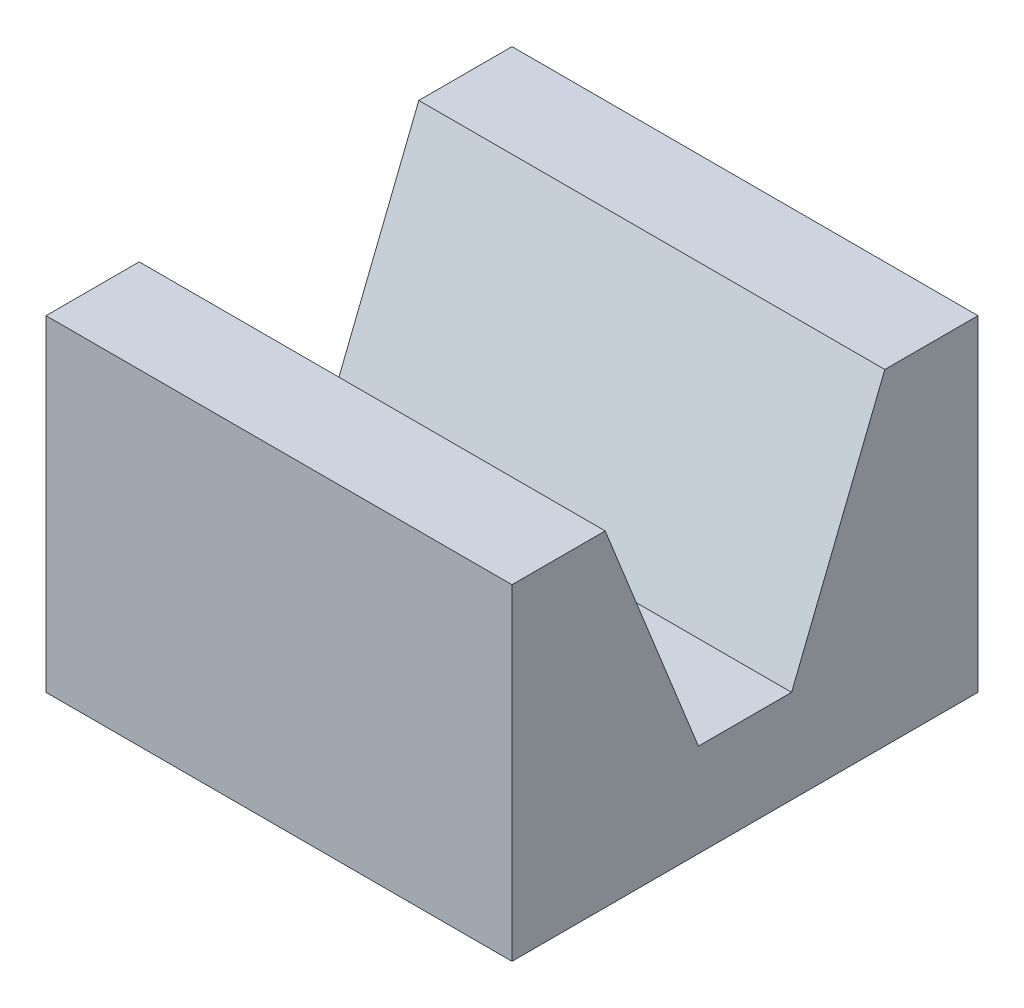
ISO-10303-21;
HEADER;
FILE_DESCRIPTION(('STEP AP214'),'2;1');
FILE_NAME('part.step','',(''),(''),'','','');
FILE_SCHEMA(('AUTOMOTIVE_DESIGN { 1 0 10303 214 1 1 1 1 }'));
ENDSEC;
DATA;
#1=APPLICATION_CONTEXT('core data for automotive mechanical design processes');
#2=APPLICATION_PROTOCOL_DEFINITION('international standard','automotive_design',2000,#1);
#3=PRODUCT_CONTEXT('',#1,'mechanical');
#4=PRODUCT('Part','Part','',(#3));
#5=PRODUCT_RELATED_PRODUCT_CATEGORY('part','',(#4));
#6=PRODUCT_DEFINITION_FORMATION('','',#4);
#7=PRODUCT_DEFINITION_CONTEXT('part definition',#1,'design');
#8=PRODUCT_DEFINITION('design','',#6,#7);
#9=PRODUCT_DEFINITION_SHAPE('','',#8);
#10=(LENGTH_UNIT() NAMED_UNIT(*) SI_UNIT(.MILLI.,.METRE.));
#11=(NAMED_UNIT(*) PLANE_ANGLE_UNIT() SI_UNIT($,.RADIAN.));
#12=(NAMED_UNIT(*) SI_UNIT($,.STERADIAN.) SOLID_ANGLE_UNIT());
#13=UNCERTAINTY_MEASURE_WITH_UNIT(LENGTH_MEASURE(1.E-05),#10,'distance_accuracy_value','');
#14=(GEOMETRIC_REPRESENTATION_CONTEXT(3) GLOBAL_UNCERTAINTY_ASSIGNED_CONTEXT((#13)) GLOBAL_UNIT_ASSIGNED_CONTEXT((#10,
#11,#12)) REPRESENTATION_CONTEXT('',''));
#15=CARTESIAN_POINT('',(0.,0.,0.));
#16=DIRECTION('',(0.,0.,1.));
#17=DIRECTION('',(1.,0.,0.));
#18=AXIS2_PLACEMENT_3D('',#15,#16,#17);
#19=CARTESIAN_POINT('',(100.,0.,0.));
#20=DIRECTION('',(0.,1.,0.));
#21=DIRECTION('',(0.,0.,1.));
#22=AXIS2_PLACEMENT_3D('',#19,#20,#21);
#23=PLANE('',#22);
#24=DIRECTION('',(0.,0.,-1.));
#25=VECTOR('',#24,1.);
#26=CARTESIAN_POINT('',(0.,0.,0.));
#27=LINE('',#26,#25);
#28=CARTESIAN_POINT('',(0.,0.,50.));
#29=VERTEX_POINT('',#28);
#30=CARTESIAN_POINT('',(0.,0.,-50.));
#31=VERTEX_POINT('',#30);
#32=EDGE_CURVE('E77',#29,#31,#27,.T.);
#33=ORIENTED_EDGE('',*,*,#32,.T.);
#34=DIRECTION('',(-1.,0.,0.));
#35=VECTOR('',#34,1.);
#36=CARTESIAN_POINT('',(100.,0.,-50.));
#37=LINE('',#36,#35);
#38=CARTESIAN_POINT('',(100.,0.,-50.));
#39=VERTEX_POINT('',#38);
#40=EDGE_CURVE('E11',#39,#31,#37,.T.);
#41=ORIENTED_EDGE('',*,*,#40,.F.);
#42=DIRECTION('',(0.,0.,-1.));
#43=VECTOR('',#42,1.);
#44=CARTESIAN_POINT('',(100.,0.,0.));
#45=LINE('',#44,#43);
#46=CARTESIAN_POINT('',(100.,0.,50.));
#47=VERTEX_POINT('',#46);
#48=EDGE_CURVE('E86',#47,#39,#45,.T.);
#49=ORIENTED_EDGE('',*,*,#48,.F.);
#50=DIRECTION('',(-1.,0.,0.));
#51=VECTOR('',#50,1.);
#52=CARTESIAN_POINT('',(100.,0.,50.));
#53=LINE('',#52,#51);
#54=EDGE_CURVE('E104',#47,#29,#53,.T.);
#55=ORIENTED_EDGE('',*,*,#54,.T.);
#56=EDGE_LOOP('',(#33,#41,#49,#55));
#57=FACE_BOUND('',#56,.T.);
#58=ADVANCED_FACE('F33',(#57),#23,.F.);
#59=CARTESIAN_POINT('',(100.,0.,-50.));
#60=DIRECTION('',(0.,0.,1.));
#61=DIRECTION('',(1.,0.,0.));
#62=AXIS2_PLACEMENT_3D('',#59,#60,#61);
#63=PLANE('',#62);
#64=DIRECTION('',(0.,1.,0.));
#65=VECTOR('',#64,1.);
#66=CARTESIAN_POINT('',(0.,0.,-50.));
#67=LINE('',#66,#65);
#68=CARTESIAN_POINT('',(0.,70.,-50.));
#69=VERTEX_POINT('',#68);
#70=EDGE_CURVE('E68',#31,#69,#67,.T.);
#71=ORIENTED_EDGE('',*,*,#70,.T.);
#72=DIRECTION('',(-1.,0.,0.));
#73=VECTOR('',#72,1.);
#74=CARTESIAN_POINT('',(100.,70.,-50.));
#75=LINE('',#74,#73);
#76=CARTESIAN_POINT('',(100.,70.,-50.));
#77=VERTEX_POINT('',#76);
#78=EDGE_CURVE('E40',#77,#69,#75,.T.);
#79=ORIENTED_EDGE('',*,*,#78,.F.);
#80=DIRECTION('',(0.,1.,0.));
#81=VECTOR('',#80,1.);
#82=CARTESIAN_POINT('',(100.,0.,-50.));
#83=LINE('',#82,#81);
#84=EDGE_CURVE('E56',#39,#77,#83,.T.);
#85=ORIENTED_EDGE('',*,*,#84,.F.);
#86=ORIENTED_EDGE('',*,*,#40,.T.);
#87=EDGE_LOOP('',(#71,#79,#85,#86));
#88=FACE_BOUND('',#87,.T.);
#89=ADVANCED_FACE('F70',(#88),#63,.F.);
#90=CARTESIAN_POINT('',(100.,70.,0.));
#91=DIRECTION('',(0.,-1.,0.));
#92=DIRECTION('',(0.,0.,-1.));
#93=AXIS2_PLACEMENT_3D('',#90,#91,#92);
#94=PLANE('',#93);
#95=DIRECTION('',(0.,0.,1.));
#96=VECTOR('',#95,1.);
#97=CARTESIAN_POINT('',(0.,70.,0.));
#98=LINE('',#97,#96);
#99=CARTESIAN_POINT('',(0.,70.,-30.));
#100=VERTEX_POINT('',#99);
#101=EDGE_CURVE('E76',#69,#100,#98,.T.);
#102=ORIENTED_EDGE('',*,*,#101,.T.);
#103=DIRECTION('',(1.,0.,0.));
#104=VECTOR('',#103,1.);
#105=CARTESIAN_POINT('',(0.,70.,-30.));
#106=LINE('',#105,#104);
#107=CARTESIAN_POINT('',(100.,70.,-30.));
#108=VERTEX_POINT('',#107);
#109=EDGE_CURVE('E91',#100,#108,#106,.T.);
#110=ORIENTED_EDGE('',*,*,#109,.T.);
#111=DIRECTION('',(0.,0.,1.));
#112=VECTOR('',#111,1.);
#113=CARTESIAN_POINT('',(100.,70.,0.));
#114=LINE('',#113,#112);
#115=EDGE_CURVE('E83',#77,#108,#114,.T.);
#116=ORIENTED_EDGE('',*,*,#115,.F.);
#117=ORIENTED_EDGE('',*,*,#78,.T.);
#118=EDGE_LOOP('',(#102,#110,#116,#117));
#119=FACE_BOUND('',#118,.T.);
#120=ADVANCED_FACE('F81',(#119),#94,.F.);
#121=CARTESIAN_POINT('',(100.,0.,0.));
#122=DIRECTION('',(-1.,0.,0.));
#123=DIRECTION('',(0.,0.,1.));
#124=AXIS2_PLACEMENT_3D('',#121,#122,#123);
#125=PLANE('',#124);
#126=ORIENTED_EDGE('',*,*,#115,.T.);
#127=DIRECTION('',(0.,0.928476690885259,-0.371390676354104));
#128=VECTOR('',#127,1.);
#129=CARTESIAN_POINT('',(100.,70.,-30.));
#130=LINE('',#129,#128);
#131=CARTESIAN_POINT('',(100.,20.,-10.));
#132=VERTEX_POINT('',#131);
#133=EDGE_CURVE('E97',#132,#108,#130,.T.);
#134=ORIENTED_EDGE('',*,*,#133,.F.);
#135=DIRECTION('',(0.,0.,-1.));
#136=VECTOR('',#135,1.);
#137=CARTESIAN_POINT('',(100.,20.,-10.));
#138=LINE('',#137,#136);
#139=CARTESIAN_POINT('',(100.,20.,10.));
#140=VERTEX_POINT('',#139);
#141=EDGE_CURVE('E101',#140,#132,#138,.T.);
#142=ORIENTED_EDGE('',*,*,#141,.F.);
#143=DIRECTION('',(0.,0.928476690885259,0.371390676354104));
#144=VECTOR('',#143,1.);
#145=CARTESIAN_POINT('',(100.,70.,30.));
#146=LINE('',#145,#144);
#147=CARTESIAN_POINT('',(100.,70.,30.));
#148=VERTEX_POINT('',#147);
#149=EDGE_CURVE('E131',#140,#148,#146,.T.);
#150=ORIENTED_EDGE('',*,*,#149,.T.);
#151=DIRECTION('',(0.,0.,-1.));
#152=VECTOR('',#151,1.);
#153=CARTESIAN_POINT('',(100.,70.,0.));
#154=LINE('',#153,#152);
#155=CARTESIAN_POINT('',(100.,70.,50.));
#156=VERTEX_POINT('',#155);
#157=EDGE_CURVE('E112',#156,#148,#154,.T.);
#158=ORIENTED_EDGE('',*,*,#157,.F.);
#159=DIRECTION('',(0.,1.,0.));
#160=VECTOR('',#159,1.);
#161=CARTESIAN_POINT('',(100.,0.,50.));
#162=LINE('',#161,#160);
#163=EDGE_CURVE('E116',#47,#156,#162,.T.);
#164=ORIENTED_EDGE('',*,*,#163,.F.);
#165=ORIENTED_EDGE('',*,*,#48,.T.);
#166=ORIENTED_EDGE('',*,*,#84,.T.);
#167=EDGE_LOOP('',(#126,#134,#142,#150,#158,#164,#165,#166));
#168=FACE_BOUND('',#167,.T.);
#169=ADVANCED_FACE('F164',(#168),#125,.F.);
#170=CARTESIAN_POINT('',(0.,0.,0.));
#171=DIRECTION('',(-1.,0.,0.));
#172=DIRECTION('',(0.,0.,1.));
#173=AXIS2_PLACEMENT_3D('',#170,#171,#172);
#174=PLANE('',#173);
#175=DIRECTION('',(0.,0.928476690885259,-0.371390676354104));
#176=VECTOR('',#175,1.);
#177=CARTESIAN_POINT('',(0.,70.,-30.));
#178=LINE('',#177,#176);
#179=CARTESIAN_POINT('',(0.,20.,-10.));
#180=VERTEX_POINT('',#179);
#181=EDGE_CURVE('E47',#180,#100,#178,.T.);
#182=ORIENTED_EDGE('',*,*,#181,.T.);
#183=ORIENTED_EDGE('',*,*,#101,.F.);
#184=ORIENTED_EDGE('',*,*,#70,.F.);
#185=ORIENTED_EDGE('',*,*,#32,.F.);
#186=DIRECTION('',(0.,1.,0.));
#187=VECTOR('',#186,1.);
#188=CARTESIAN_POINT('',(0.,0.,50.));
#189=LINE('',#188,#187);
#190=CARTESIAN_POINT('',(0.,70.,50.));
#191=VERTEX_POINT('',#190);
#192=EDGE_CURVE('E117',#29,#191,#189,.T.);
#193=ORIENTED_EDGE('',*,*,#192,.T.);
#194=DIRECTION('',(0.,0.,-1.));
#195=VECTOR('',#194,1.);
#196=CARTESIAN_POINT('',(0.,70.,0.));
#197=LINE('',#196,#195);
#198=CARTESIAN_POINT('',(0.,70.,30.));
#199=VERTEX_POINT('',#198);
#200=EDGE_CURVE('E113',#191,#199,#197,.T.);
#201=ORIENTED_EDGE('',*,*,#200,.T.);
#202=DIRECTION('',(0.,0.928476690885259,0.371390676354104));
#203=VECTOR('',#202,1.);
#204=CARTESIAN_POINT('',(0.,70.,30.));
#205=LINE('',#204,#203);
#206=CARTESIAN_POINT('',(0.,20.,10.));
#207=VERTEX_POINT('',#206);
#208=EDGE_CURVE('E128',#207,#199,#205,.T.);
#209=ORIENTED_EDGE('',*,*,#208,.F.);
#210=DIRECTION('',(0.,0.,-1.));
#211=VECTOR('',#210,1.);
#212=CARTESIAN_POINT('',(0.,20.,-10.));
#213=LINE('',#212,#211);
#214=EDGE_CURVE('E100',#207,#180,#213,.T.);
#215=ORIENTED_EDGE('',*,*,#214,.T.);
#216=EDGE_LOOP('',(#182,#183,#184,#185,#193,#201,#209,#215));
#217=FACE_BOUND('',#216,.T.);
#218=ADVANCED_FACE('F84',(#217),#174,.T.);
#219=CARTESIAN_POINT('',(0.,70.,-30.));
#220=DIRECTION('',(0.,-0.371390676354104,-0.928476690885259));
#221=DIRECTION('',(0.,0.92847669088526,-0.371390676354104));
#222=AXIS2_PLACEMENT_3D('',#219,#220,#221);
#223=PLANE('',#222);
#224=ORIENTED_EDGE('',*,*,#133,.T.);
#225=ORIENTED_EDGE('',*,*,#109,.F.);
#226=ORIENTED_EDGE('',*,*,#181,.F.);
#227=DIRECTION('',(1.,0.,0.));
#228=VECTOR('',#227,1.);
#229=CARTESIAN_POINT('',(0.,20.,-10.));
#230=LINE('',#229,#228);
#231=EDGE_CURVE('E94',#180,#132,#230,.T.);
#232=ORIENTED_EDGE('',*,*,#231,.T.);
#233=EDGE_LOOP('',(#224,#225,#226,#232));
#234=FACE_BOUND('',#233,.T.);
#235=ADVANCED_FACE('F174',(#234),#223,.F.);
#236=CARTESIAN_POINT('',(0.,20.,-10.));
#237=DIRECTION('',(0.,-1.,0.));
#238=DIRECTION('',(0.,0.,-1.));
#239=AXIS2_PLACEMENT_3D('',#236,#237,#238);
#240=PLANE('',#239);
#241=ORIENTED_EDGE('',*,*,#141,.T.);
#242=ORIENTED_EDGE('',*,*,#231,.F.);
#243=ORIENTED_EDGE('',*,*,#214,.F.);
#244=DIRECTION('',(1.,0.,0.));
#245=VECTOR('',#244,1.);
#246=CARTESIAN_POINT('',(0.,20.,10.));
#247=LINE('',#246,#245);
#248=EDGE_CURVE('E125',#207,#140,#247,.T.);
#249=ORIENTED_EDGE('',*,*,#248,.T.);
#250=EDGE_LOOP('',(#241,#242,#243,#249));
#251=FACE_BOUND('',#250,.T.);
#252=ADVANCED_FACE('F179',(#251),#240,.F.);
#253=CARTESIAN_POINT('',(100.,0.,50.));
#254=DIRECTION('',(0.,0.,-1.));
#255=DIRECTION('',(1.,0.,0.));
#256=AXIS2_PLACEMENT_3D('',#253,#254,#255);
#257=PLANE('',#256);
#258=ORIENTED_EDGE('',*,*,#192,.F.);
#259=ORIENTED_EDGE('',*,*,#54,.F.);
#260=ORIENTED_EDGE('',*,*,#163,.T.);
#261=DIRECTION('',(-1.,0.,0.));
#262=VECTOR('',#261,1.);
#263=CARTESIAN_POINT('',(100.,70.,50.));
#264=LINE('',#263,#262);
#265=EDGE_CURVE('E109',#156,#191,#264,.T.);
#266=ORIENTED_EDGE('',*,*,#265,.T.);
#267=EDGE_LOOP('',(#258,#259,#260,#266));
#268=FACE_BOUND('',#267,.T.);
#269=ADVANCED_FACE('F157',(#268),#257,.F.);
#270=CARTESIAN_POINT('',(100.,70.,0.));
#271=DIRECTION('',(0.,-1.,0.));
#272=DIRECTION('',(0.,0.,1.));
#273=AXIS2_PLACEMENT_3D('',#270,#271,#272);
#274=PLANE('',#273);
#275=ORIENTED_EDGE('',*,*,#200,.F.);
#276=ORIENTED_EDGE('',*,*,#265,.F.);
#277=ORIENTED_EDGE('',*,*,#157,.T.);
#278=DIRECTION('',(1.,0.,0.));
#279=VECTOR('',#278,1.);
#280=CARTESIAN_POINT('',(0.,70.,30.));
#281=LINE('',#280,#279);
#282=EDGE_CURVE('E120',#199,#148,#281,.T.);
#283=ORIENTED_EDGE('',*,*,#282,.F.);
#284=EDGE_LOOP('',(#275,#276,#277,#283));
#285=FACE_BOUND('',#284,.T.);
#286=ADVANCED_FACE('F148',(#285),#274,.F.);
#287=CARTESIAN_POINT('',(0.,70.,30.));
#288=DIRECTION('',(0.,-0.371390676354104,0.928476690885259));
#289=DIRECTION('',(0.,0.92847669088526,0.371390676354104));
#290=AXIS2_PLACEMENT_3D('',#287,#288,#289);
#291=PLANE('',#290);
#292=ORIENTED_EDGE('',*,*,#149,.F.);
#293=ORIENTED_EDGE('',*,*,#248,.F.);
#294=ORIENTED_EDGE('',*,*,#208,.T.);
#295=ORIENTED_EDGE('',*,*,#282,.T.);
#296=EDGE_LOOP('',(#292,#293,#294,#295));
#297=FACE_BOUND('',#296,.T.);
#298=ADVANCED_FACE('F141',(#297),#291,.F.);
#299=CLOSED_SHELL('',(#58,#89,#120,#169,#218,#235,#252,#269,#286,#298));
#300=MANIFOLD_SOLID_BREP('B2',#299);
#301=ADVANCED_BREP_SHAPE_REPRESENTATION('',(#18,#300),#14);
#302=SHAPE_DEFINITION_REPRESENTATION(#9,#301);
ENDSEC;
END-ISO-10303-21;
